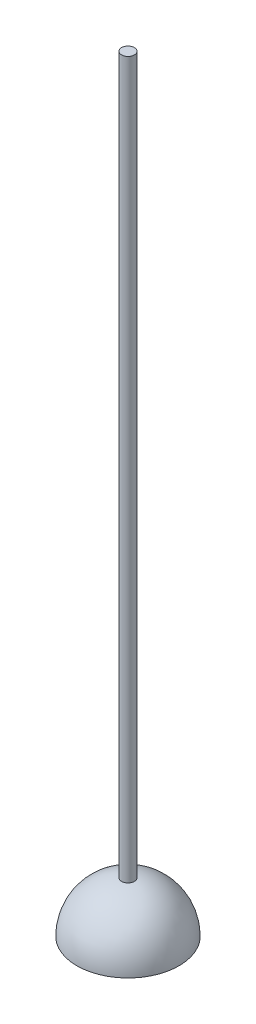
ISO-10303-21;
HEADER;
FILE_DESCRIPTION(('STEP AP214'),'2;1');
FILE_NAME('part.step','',(''),(''),'','','');
FILE_SCHEMA(('AUTOMOTIVE_DESIGN { 1 0 10303 214 1 1 1 1 }'));
ENDSEC;
DATA;
#1=APPLICATION_CONTEXT('core data for automotive mechanical design processes');
#2=APPLICATION_PROTOCOL_DEFINITION('international standard','automotive_design',2000,#1);
#3=PRODUCT_CONTEXT('',#1,'mechanical');
#4=PRODUCT('Part','Part','',(#3));
#5=PRODUCT_RELATED_PRODUCT_CATEGORY('part','',(#4));
#6=PRODUCT_DEFINITION_FORMATION('','',#4);
#7=PRODUCT_DEFINITION_CONTEXT('part definition',#1,'design');
#8=PRODUCT_DEFINITION('design','',#6,#7);
#9=PRODUCT_DEFINITION_SHAPE('','',#8);
#10=(LENGTH_UNIT() NAMED_UNIT(*) SI_UNIT(.MILLI.,.METRE.));
#11=(NAMED_UNIT(*) PLANE_ANGLE_UNIT() SI_UNIT($,.RADIAN.));
#12=(NAMED_UNIT(*) SI_UNIT($,.STERADIAN.) SOLID_ANGLE_UNIT());
#13=UNCERTAINTY_MEASURE_WITH_UNIT(LENGTH_MEASURE(1.E-05),#10,'distance_accuracy_value','');
#14=(GEOMETRIC_REPRESENTATION_CONTEXT(3) GLOBAL_UNCERTAINTY_ASSIGNED_CONTEXT((#13)) GLOBAL_UNIT_ASSIGNED_CONTEXT((#10,
#11,#12)) REPRESENTATION_CONTEXT('',''));
#15=CARTESIAN_POINT('',(0.,0.,0.));
#16=DIRECTION('',(0.,0.,1.));
#17=DIRECTION('',(1.,0.,0.));
#18=AXIS2_PLACEMENT_3D('',#15,#16,#17);
#19=CARTESIAN_POINT('',(0.,0.,0.));
#20=DIRECTION('',(0.,-1.,0.));
#21=DIRECTION('',(1.,0.,0.));
#22=AXIS2_PLACEMENT_3D('',#19,#20,#21);
#23=SPHERICAL_SURFACE('',#22,100.);
#24=CARTESIAN_POINT('',(0.,99.2156741649222,0.));
#25=DIRECTION('',(0.,1.,0.));
#26=DIRECTION('',(0.,0.,1.));
#27=AXIS2_PLACEMENT_3D('',#24,#25,#26);
#28=CIRCLE('',#27,12.5);
#29=CARTESIAN_POINT('',(0.,99.2156741649222,12.5));
#30=VERTEX_POINT('',#29);
#31=EDGE_CURVE('E52',#30,#30,#28,.T.);
#32=ORIENTED_EDGE('',*,*,#31,.F.);
#33=EDGE_LOOP('',(#32));
#34=FACE_BOUND('',#33,.T.);
#35=CARTESIAN_POINT('',(0.,0.,0.));
#36=DIRECTION('',(0.,1.,0.));
#37=DIRECTION('',(0.,0.,1.));
#38=AXIS2_PLACEMENT_3D('',#35,#36,#37);
#39=CIRCLE('',#38,100.);
#40=CARTESIAN_POINT('',(0.,0.,100.));
#41=VERTEX_POINT('',#40);
#42=EDGE_CURVE('E10',#41,#41,#39,.T.);
#43=ORIENTED_EDGE('',*,*,#42,.T.);
#44=EDGE_LOOP('',(#43));
#45=FACE_BOUND('',#44,.T.);
#46=ADVANCED_FACE('F45',(#34,#45),#23,.T.);
#47=CARTESIAN_POINT('',(0.,0.,0.));
#48=DIRECTION('',(0.,1.,0.));
#49=DIRECTION('',(0.,0.,-1.));
#50=AXIS2_PLACEMENT_3D('',#47,#48,#49);
#51=PLANE('',#50);
#52=ORIENTED_EDGE('',*,*,#42,.F.);
#53=EDGE_LOOP('',(#52));
#54=FACE_BOUND('',#53,.T.);
#55=ADVANCED_FACE('F69',(#54),#51,.F.);
#56=CARTESIAN_POINT('',(0.,1500.,0.));
#57=DIRECTION('',(0.,-1.,0.));
#58=DIRECTION('',(0.,0.,1.));
#59=AXIS2_PLACEMENT_3D('',#56,#57,#58);
#60=CYLINDRICAL_SURFACE('',#59,12.5);
#61=CARTESIAN_POINT('',(0.,1500.,0.));
#62=DIRECTION('',(0.,1.,0.));
#63=DIRECTION('',(0.,0.,1.));
#64=AXIS2_PLACEMENT_3D('',#61,#62,#63);
#65=CIRCLE('',#64,12.5);
#66=CARTESIAN_POINT('',(0.,1500.,12.5));
#67=VERTEX_POINT('',#66);
#68=EDGE_CURVE('E57',#67,#67,#65,.T.);
#69=ORIENTED_EDGE('',*,*,#68,.F.);
#70=EDGE_LOOP('',(#69));
#71=FACE_BOUND('',#70,.T.);
#72=ORIENTED_EDGE('',*,*,#31,.T.);
#73=EDGE_LOOP('',(#72));
#74=FACE_BOUND('',#73,.T.);
#75=ADVANCED_FACE('F67',(#71,#74),#60,.T.);
#76=CARTESIAN_POINT('',(0.,1500.,0.));
#77=DIRECTION('',(0.,-1.,0.));
#78=DIRECTION('',(0.,0.,1.));
#79=AXIS2_PLACEMENT_3D('',#76,#77,#78);
#80=PLANE('',#79);
#81=ORIENTED_EDGE('',*,*,#68,.T.);
#82=EDGE_LOOP('',(#81));
#83=FACE_BOUND('',#82,.T.);
#84=ADVANCED_FACE('F65',(#83),#80,.F.);
#85=CLOSED_SHELL('',(#46,#55,#75,#84));
#86=MANIFOLD_SOLID_BREP('B2',#85);
#87=ADVANCED_BREP_SHAPE_REPRESENTATION('',(#18,#86),#14);
#88=SHAPE_DEFINITION_REPRESENTATION(#9,#87);
ENDSEC;
END-ISO-10303-21;
